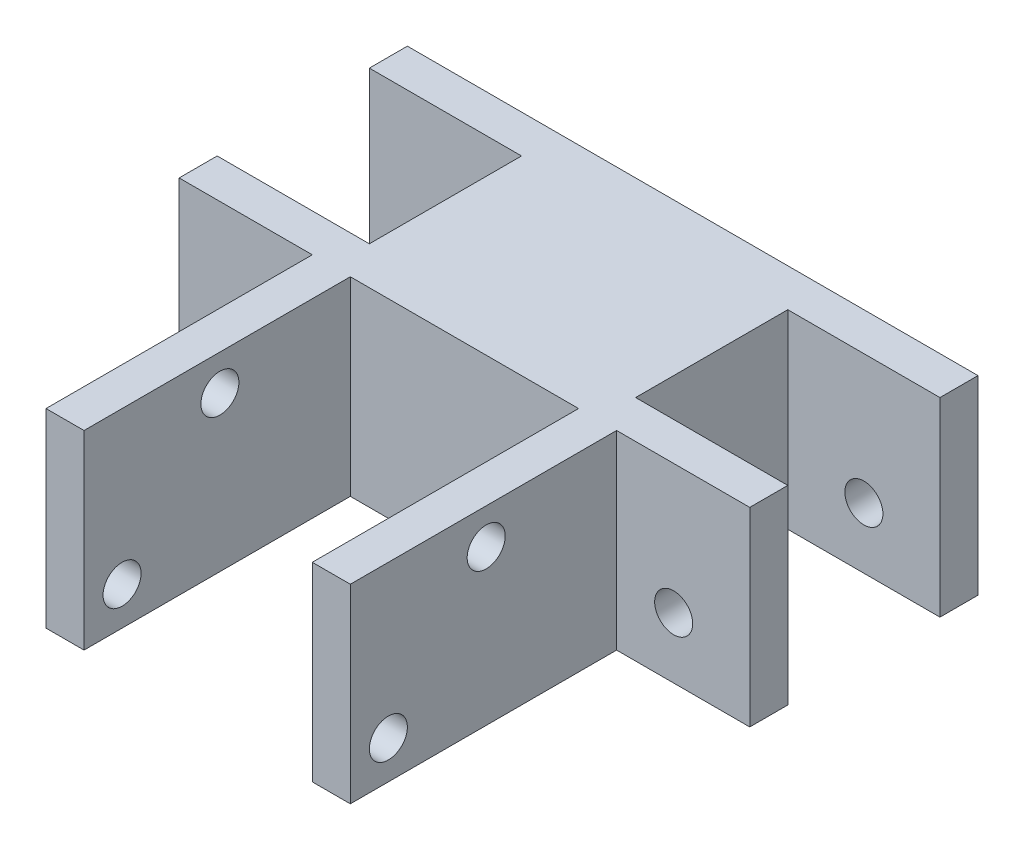
ISO-10303-21;
HEADER;
FILE_DESCRIPTION(('STEP AP214'),'2;1');
FILE_NAME('part.step','',(''),(''),'','','');
FILE_SCHEMA(('AUTOMOTIVE_DESIGN { 1 0 10303 214 1 1 1 1 }'));
ENDSEC;
DATA;
#1=APPLICATION_CONTEXT('core data for automotive mechanical design processes');
#2=APPLICATION_PROTOCOL_DEFINITION('international standard','automotive_design',2000,#1);
#3=PRODUCT_CONTEXT('',#1,'mechanical');
#4=PRODUCT('Part','Part','',(#3));
#5=PRODUCT_RELATED_PRODUCT_CATEGORY('part','',(#4));
#6=PRODUCT_DEFINITION_FORMATION('','',#4);
#7=PRODUCT_DEFINITION_CONTEXT('part definition',#1,'design');
#8=PRODUCT_DEFINITION('design','',#6,#7);
#9=PRODUCT_DEFINITION_SHAPE('','',#8);
#10=(LENGTH_UNIT() NAMED_UNIT(*) SI_UNIT(.MILLI.,.METRE.));
#11=(NAMED_UNIT(*) PLANE_ANGLE_UNIT() SI_UNIT($,.RADIAN.));
#12=(NAMED_UNIT(*) SI_UNIT($,.STERADIAN.) SOLID_ANGLE_UNIT());
#13=UNCERTAINTY_MEASURE_WITH_UNIT(LENGTH_MEASURE(1.E-05),#10,'distance_accuracy_value','');
#14=(GEOMETRIC_REPRESENTATION_CONTEXT(3) GLOBAL_UNCERTAINTY_ASSIGNED_CONTEXT((#13)) GLOBAL_UNIT_ASSIGNED_CONTEXT((#10,
#11,#12)) REPRESENTATION_CONTEXT('',''));
#15=CARTESIAN_POINT('',(0.,0.,0.));
#16=DIRECTION('',(0.,0.,1.));
#17=DIRECTION('',(1.,0.,0.));
#18=AXIS2_PLACEMENT_3D('',#15,#16,#17);
#19=CARTESIAN_POINT('',(-25.4,31.75,63.5));
#20=DIRECTION('',(0.,0.,-1.));
#21=DIRECTION('',(-1.,0.,0.));
#22=AXIS2_PLACEMENT_3D('',#19,#20,#21);
#23=PLANE('',#22);
#24=DIRECTION('',(1.,0.,0.));
#25=VECTOR('',#24,1.);
#26=CARTESIAN_POINT('',(-25.4,0.,63.5));
#27=LINE('',#26,#25);
#28=CARTESIAN_POINT('',(-25.4,0.,63.5));
#29=VERTEX_POINT('',#28);
#30=CARTESIAN_POINT('',(-19.05,0.,63.5));
#31=VERTEX_POINT('',#30);
#32=EDGE_CURVE('E207',#29,#31,#27,.T.);
#33=ORIENTED_EDGE('',*,*,#32,.T.);
#34=DIRECTION('',(0.,-1.,0.));
#35=VECTOR('',#34,1.);
#36=CARTESIAN_POINT('',(-19.05,31.75,63.5));
#37=LINE('',#36,#35);
#38=CARTESIAN_POINT('',(-19.05,31.75,63.5));
#39=VERTEX_POINT('',#38);
#40=EDGE_CURVE('E11',#39,#31,#37,.T.);
#41=ORIENTED_EDGE('',*,*,#40,.F.);
#42=DIRECTION('',(1.,0.,0.));
#43=VECTOR('',#42,1.);
#44=CARTESIAN_POINT('',(-25.4,31.75,63.5));
#45=LINE('',#44,#43);
#46=CARTESIAN_POINT('',(-25.4,31.75,63.5));
#47=VERTEX_POINT('',#46);
#48=EDGE_CURVE('E247',#47,#39,#45,.T.);
#49=ORIENTED_EDGE('',*,*,#48,.F.);
#50=DIRECTION('',(0.,-1.,0.));
#51=VECTOR('',#50,1.);
#52=CARTESIAN_POINT('',(-25.4,31.75,63.5));
#53=LINE('',#52,#51);
#54=EDGE_CURVE('E203',#47,#29,#53,.T.);
#55=ORIENTED_EDGE('',*,*,#54,.T.);
#56=EDGE_LOOP('',(#33,#41,#49,#55));
#57=FACE_BOUND('',#56,.T.);
#58=ADVANCED_FACE('F39',(#57),#23,.F.);
#59=CARTESIAN_POINT('',(-19.05,31.75,63.5));
#60=DIRECTION('',(-1.,0.,0.));
#61=DIRECTION('',(0.,0.,1.));
#62=AXIS2_PLACEMENT_3D('',#59,#60,#61);
#63=PLANE('',#62);
#64=CARTESIAN_POINT('',(-19.05,6.35,57.15));
#65=DIRECTION('',(-1.,0.,0.));
#66=DIRECTION('',(0.,0.,1.));
#67=AXIS2_PLACEMENT_3D('',#64,#65,#66);
#68=CIRCLE('',#67,3.175);
#69=CARTESIAN_POINT('',(-19.05,6.35,60.325));
#70=VERTEX_POINT('',#69);
#71=EDGE_CURVE('E562',#70,#70,#68,.T.);
#72=ORIENTED_EDGE('',*,*,#71,.T.);
#73=EDGE_LOOP('',(#72));
#74=FACE_BOUND('',#73,.T.);
#75=CARTESIAN_POINT('',(-19.05,25.8075288552219,40.8231947139618));
#76=DIRECTION('',(-1.,0.,0.));
#77=DIRECTION('',(0.,0.,1.));
#78=AXIS2_PLACEMENT_3D('',#75,#76,#77);
#79=CIRCLE('',#78,3.175);
#80=CARTESIAN_POINT('',(-19.05,25.8075288552219,43.9981947139618));
#81=VERTEX_POINT('',#80);
#82=EDGE_CURVE('E567',#81,#81,#79,.T.);
#83=ORIENTED_EDGE('',*,*,#82,.T.);
#84=EDGE_LOOP('',(#83));
#85=FACE_BOUND('',#84,.T.);
#86=DIRECTION('',(0.,0.,-1.));
#87=VECTOR('',#86,1.);
#88=CARTESIAN_POINT('',(-19.05,0.,63.5));
#89=LINE('',#88,#87);
#90=CARTESIAN_POINT('',(-19.05,0.,19.05));
#91=VERTEX_POINT('',#90);
#92=EDGE_CURVE('E210',#31,#91,#89,.T.);
#93=ORIENTED_EDGE('',*,*,#92,.T.);
#94=DIRECTION('',(0.,-1.,0.));
#95=VECTOR('',#94,1.);
#96=CARTESIAN_POINT('',(-19.05,31.75,19.05));
#97=LINE('',#96,#95);
#98=CARTESIAN_POINT('',(-19.05,31.75,19.05));
#99=VERTEX_POINT('',#98);
#100=EDGE_CURVE('E47',#99,#91,#97,.T.);
#101=ORIENTED_EDGE('',*,*,#100,.F.);
#102=DIRECTION('',(0.,0.,-1.));
#103=VECTOR('',#102,1.);
#104=CARTESIAN_POINT('',(-19.05,31.75,63.5));
#105=LINE('',#104,#103);
#106=EDGE_CURVE('E134',#39,#99,#105,.T.);
#107=ORIENTED_EDGE('',*,*,#106,.F.);
#108=ORIENTED_EDGE('',*,*,#40,.T.);
#109=EDGE_LOOP('',(#93,#101,#107,#108));
#110=FACE_BOUND('',#109,.T.);
#111=ADVANCED_FACE('F371',(#74,#85,#110),#63,.F.);
#112=CARTESIAN_POINT('',(-19.05,31.75,19.05));
#113=DIRECTION('',(0.,0.,-1.));
#114=DIRECTION('',(-1.,0.,0.));
#115=AXIS2_PLACEMENT_3D('',#112,#113,#114);
#116=PLANE('',#115);
#117=DIRECTION('',(1.,0.,0.));
#118=VECTOR('',#117,1.);
#119=CARTESIAN_POINT('',(-19.05,0.,19.05));
#120=LINE('',#119,#118);
#121=CARTESIAN_POINT('',(19.05,0.,19.05));
#122=VERTEX_POINT('',#121);
#123=EDGE_CURVE('E213',#91,#122,#120,.T.);
#124=ORIENTED_EDGE('',*,*,#123,.T.);
#125=DIRECTION('',(0.,-1.,0.));
#126=VECTOR('',#125,1.);
#127=CARTESIAN_POINT('',(19.05,31.75,19.05));
#128=LINE('',#127,#126);
#129=CARTESIAN_POINT('',(19.05,31.75,19.05));
#130=VERTEX_POINT('',#129);
#131=EDGE_CURVE('E290',#130,#122,#128,.T.);
#132=ORIENTED_EDGE('',*,*,#131,.F.);
#133=DIRECTION('',(1.,0.,0.));
#134=VECTOR('',#133,1.);
#135=CARTESIAN_POINT('',(-19.05,31.75,19.05));
#136=LINE('',#135,#134);
#137=EDGE_CURVE('E298',#99,#130,#136,.T.);
#138=ORIENTED_EDGE('',*,*,#137,.F.);
#139=ORIENTED_EDGE('',*,*,#100,.T.);
#140=EDGE_LOOP('',(#124,#132,#138,#139));
#141=FACE_BOUND('',#140,.T.);
#142=ADVANCED_FACE('F296',(#141),#116,.F.);
#143=CARTESIAN_POINT('',(19.05,31.75,19.05));
#144=DIRECTION('',(1.,0.,0.));
#145=DIRECTION('',(0.,0.,-1.));
#146=AXIS2_PLACEMENT_3D('',#143,#144,#145);
#147=PLANE('',#146);
#148=CARTESIAN_POINT('',(19.05,6.35,57.15));
#149=DIRECTION('',(-1.,0.,0.));
#150=DIRECTION('',(0.,0.,1.));
#151=AXIS2_PLACEMENT_3D('',#148,#149,#150);
#152=CIRCLE('',#151,3.175);
#153=CARTESIAN_POINT('',(19.05,6.35,60.325));
#154=VERTEX_POINT('',#153);
#155=EDGE_CURVE('E548',#154,#154,#152,.T.);
#156=ORIENTED_EDGE('',*,*,#155,.F.);
#157=EDGE_LOOP('',(#156));
#158=FACE_BOUND('',#157,.T.);
#159=CARTESIAN_POINT('',(19.05,25.8075288552219,40.8231947139618));
#160=DIRECTION('',(-1.,0.,0.));
#161=DIRECTION('',(0.,0.,1.));
#162=AXIS2_PLACEMENT_3D('',#159,#160,#161);
#163=CIRCLE('',#162,3.175);
#164=CARTESIAN_POINT('',(19.05,25.8075288552219,43.9981947139618));
#165=VERTEX_POINT('',#164);
#166=EDGE_CURVE('E556',#165,#165,#163,.T.);
#167=ORIENTED_EDGE('',*,*,#166,.F.);
#168=EDGE_LOOP('',(#167));
#169=FACE_BOUND('',#168,.T.);
#170=DIRECTION('',(0.,0.,1.));
#171=VECTOR('',#170,1.);
#172=CARTESIAN_POINT('',(19.05,0.,19.05));
#173=LINE('',#172,#171);
#174=CARTESIAN_POINT('',(19.05,0.,63.5));
#175=VERTEX_POINT('',#174);
#176=EDGE_CURVE('E215',#122,#175,#173,.T.);
#177=ORIENTED_EDGE('',*,*,#176,.T.);
#178=DIRECTION('',(0.,-1.,0.));
#179=VECTOR('',#178,1.);
#180=CARTESIAN_POINT('',(19.05,31.75,63.5));
#181=LINE('',#180,#179);
#182=CARTESIAN_POINT('',(19.05,31.75,63.5));
#183=VERTEX_POINT('',#182);
#184=EDGE_CURVE('E287',#183,#175,#181,.T.);
#185=ORIENTED_EDGE('',*,*,#184,.F.);
#186=DIRECTION('',(0.,0.,1.));
#187=VECTOR('',#186,1.);
#188=CARTESIAN_POINT('',(19.05,31.75,19.05));
#189=LINE('',#188,#187);
#190=EDGE_CURVE('E316',#130,#183,#189,.T.);
#191=ORIENTED_EDGE('',*,*,#190,.F.);
#192=ORIENTED_EDGE('',*,*,#131,.T.);
#193=EDGE_LOOP('',(#177,#185,#191,#192));
#194=FACE_BOUND('',#193,.T.);
#195=ADVANCED_FACE('F307',(#158,#169,#194),#147,.F.);
#196=CARTESIAN_POINT('',(25.4,31.75,63.5));
#197=DIRECTION('',(0.,0.,-1.));
#198=DIRECTION('',(-1.,0.,0.));
#199=AXIS2_PLACEMENT_3D('',#196,#197,#198);
#200=PLANE('',#199);
#201=DIRECTION('',(1.,0.,0.));
#202=VECTOR('',#201,1.);
#203=CARTESIAN_POINT('',(25.4,0.,63.5));
#204=LINE('',#203,#202);
#205=CARTESIAN_POINT('',(25.4,0.,63.5));
#206=VERTEX_POINT('',#205);
#207=EDGE_CURVE('E217',#175,#206,#204,.T.);
#208=ORIENTED_EDGE('',*,*,#207,.T.);
#209=DIRECTION('',(0.,-1.,0.));
#210=VECTOR('',#209,1.);
#211=CARTESIAN_POINT('',(25.4,31.75,63.5));
#212=LINE('',#211,#210);
#213=CARTESIAN_POINT('',(25.4,31.75,63.5));
#214=VERTEX_POINT('',#213);
#215=EDGE_CURVE('E284',#214,#206,#212,.T.);
#216=ORIENTED_EDGE('',*,*,#215,.F.);
#217=DIRECTION('',(1.,0.,0.));
#218=VECTOR('',#217,1.);
#219=CARTESIAN_POINT('',(25.4,31.75,63.5));
#220=LINE('',#219,#218);
#221=EDGE_CURVE('E313',#183,#214,#220,.T.);
#222=ORIENTED_EDGE('',*,*,#221,.F.);
#223=ORIENTED_EDGE('',*,*,#184,.T.);
#224=EDGE_LOOP('',(#208,#216,#222,#223));
#225=FACE_BOUND('',#224,.T.);
#226=ADVANCED_FACE('F311',(#225),#200,.F.);
#227=CARTESIAN_POINT('',(25.4,31.75,19.05));
#228=DIRECTION('',(-1.,0.,0.));
#229=DIRECTION('',(0.,0.,1.));
#230=AXIS2_PLACEMENT_3D('',#227,#228,#229);
#231=PLANE('',#230);
#232=CARTESIAN_POINT('',(25.4,6.35,57.15));
#233=DIRECTION('',(-1.,0.,0.));
#234=DIRECTION('',(0.,0.,1.));
#235=AXIS2_PLACEMENT_3D('',#232,#233,#234);
#236=CIRCLE('',#235,3.175);
#237=CARTESIAN_POINT('',(25.4,6.35,60.325));
#238=VERTEX_POINT('',#237);
#239=EDGE_CURVE('E551',#238,#238,#236,.T.);
#240=ORIENTED_EDGE('',*,*,#239,.T.);
#241=EDGE_LOOP('',(#240));
#242=FACE_BOUND('',#241,.T.);
#243=CARTESIAN_POINT('',(25.4,25.8075288552219,40.8231947139618));
#244=DIRECTION('',(-1.,0.,0.));
#245=DIRECTION('',(0.,0.,1.));
#246=AXIS2_PLACEMENT_3D('',#243,#244,#245);
#247=CIRCLE('',#246,3.175);
#248=CARTESIAN_POINT('',(25.4,25.8075288552219,43.9981947139618));
#249=VERTEX_POINT('',#248);
#250=EDGE_CURVE('E553',#249,#249,#247,.T.);
#251=ORIENTED_EDGE('',*,*,#250,.T.);
#252=EDGE_LOOP('',(#251));
#253=FACE_BOUND('',#252,.T.);
#254=DIRECTION('',(0.,0.,-1.));
#255=VECTOR('',#254,1.);
#256=CARTESIAN_POINT('',(25.4,0.,19.05));
#257=LINE('',#256,#255);
#258=CARTESIAN_POINT('',(25.4,0.,19.05));
#259=VERTEX_POINT('',#258);
#260=EDGE_CURVE('E219',#206,#259,#257,.T.);
#261=ORIENTED_EDGE('',*,*,#260,.T.);
#262=DIRECTION('',(0.,-1.,0.));
#263=VECTOR('',#262,1.);
#264=CARTESIAN_POINT('',(25.4,31.75,19.05));
#265=LINE('',#264,#263);
#266=CARTESIAN_POINT('',(25.4,31.75,19.05));
#267=VERTEX_POINT('',#266);
#268=EDGE_CURVE('E281',#267,#259,#265,.T.);
#269=ORIENTED_EDGE('',*,*,#268,.F.);
#270=DIRECTION('',(0.,0.,-1.));
#271=VECTOR('',#270,1.);
#272=CARTESIAN_POINT('',(25.4,31.75,19.05));
#273=LINE('',#272,#271);
#274=EDGE_CURVE('E315',#214,#267,#273,.T.);
#275=ORIENTED_EDGE('',*,*,#274,.F.);
#276=ORIENTED_EDGE('',*,*,#215,.T.);
#277=EDGE_LOOP('',(#261,#269,#275,#276));
#278=FACE_BOUND('',#277,.T.);
#279=ADVANCED_FACE('F388',(#242,#253,#278),#231,.F.);
#280=CARTESIAN_POINT('',(25.4,31.75,19.05));
#281=DIRECTION('',(0.,0.,-1.));
#282=DIRECTION('',(-1.,0.,0.));
#283=AXIS2_PLACEMENT_3D('',#280,#281,#282);
#284=PLANE('',#283);
#285=CARTESIAN_POINT('',(34.925,10.16,19.05));
#286=DIRECTION('',(0.,0.,1.));
#287=DIRECTION('',(1.,0.,0.));
#288=AXIS2_PLACEMENT_3D('',#285,#286,#287);
#289=CIRCLE('',#288,3.175);
#290=CARTESIAN_POINT('',(38.1,10.16,19.05));
#291=VERTEX_POINT('',#290);
#292=EDGE_CURVE('E588',#291,#291,#289,.T.);
#293=ORIENTED_EDGE('',*,*,#292,.F.);
#294=EDGE_LOOP('',(#293));
#295=FACE_BOUND('',#294,.T.);
#296=DIRECTION('',(1.,0.,0.));
#297=VECTOR('',#296,1.);
#298=CARTESIAN_POINT('',(25.4,0.,19.05));
#299=LINE('',#298,#297);
#300=CARTESIAN_POINT('',(47.625,0.,19.05));
#301=VERTEX_POINT('',#300);
#302=EDGE_CURVE('E221',#259,#301,#299,.T.);
#303=ORIENTED_EDGE('',*,*,#302,.T.);
#304=DIRECTION('',(0.,-1.,0.));
#305=VECTOR('',#304,1.);
#306=CARTESIAN_POINT('',(47.625,31.75,19.05));
#307=LINE('',#306,#305);
#308=CARTESIAN_POINT('',(47.625,31.75,19.05));
#309=VERTEX_POINT('',#308);
#310=EDGE_CURVE('E278',#309,#301,#307,.T.);
#311=ORIENTED_EDGE('',*,*,#310,.F.);
#312=DIRECTION('',(1.,0.,0.));
#313=VECTOR('',#312,1.);
#314=CARTESIAN_POINT('',(25.4,31.75,19.05));
#315=LINE('',#314,#313);
#316=EDGE_CURVE('E318',#267,#309,#315,.T.);
#317=ORIENTED_EDGE('',*,*,#316,.F.);
#318=ORIENTED_EDGE('',*,*,#268,.T.);
#319=EDGE_LOOP('',(#303,#311,#317,#318));
#320=FACE_BOUND('',#319,.T.);
#321=ADVANCED_FACE('F391',(#295,#320),#284,.F.);
#322=CARTESIAN_POINT('',(47.625,31.75,19.05));
#323=DIRECTION('',(-1.,0.,0.));
#324=DIRECTION('',(0.,0.,1.));
#325=AXIS2_PLACEMENT_3D('',#322,#323,#324);
#326=PLANE('',#325);
#327=DIRECTION('',(0.,0.,-1.));
#328=VECTOR('',#327,1.);
#329=CARTESIAN_POINT('',(47.625,0.,19.05));
#330=LINE('',#329,#328);
#331=CARTESIAN_POINT('',(47.625,0.,12.7));
#332=VERTEX_POINT('',#331);
#333=EDGE_CURVE('E223',#301,#332,#330,.T.);
#334=ORIENTED_EDGE('',*,*,#333,.T.);
#335=DIRECTION('',(0.,-1.,0.));
#336=VECTOR('',#335,1.);
#337=CARTESIAN_POINT('',(47.625,31.75,12.7));
#338=LINE('',#337,#336);
#339=CARTESIAN_POINT('',(47.625,31.75,12.7));
#340=VERTEX_POINT('',#339);
#341=EDGE_CURVE('E275',#340,#332,#338,.T.);
#342=ORIENTED_EDGE('',*,*,#341,.F.);
#343=DIRECTION('',(0.,0.,-1.));
#344=VECTOR('',#343,1.);
#345=CARTESIAN_POINT('',(47.625,31.75,19.05));
#346=LINE('',#345,#344);
#347=EDGE_CURVE('E324',#309,#340,#346,.T.);
#348=ORIENTED_EDGE('',*,*,#347,.F.);
#349=ORIENTED_EDGE('',*,*,#310,.T.);
#350=EDGE_LOOP('',(#334,#342,#348,#349));
#351=FACE_BOUND('',#350,.T.);
#352=ADVANCED_FACE('F395',(#351),#326,.F.);
#353=CARTESIAN_POINT('',(22.225,31.75,12.7));
#354=DIRECTION('',(0.,0.,1.));
#355=DIRECTION('',(1.,0.,0.));
#356=AXIS2_PLACEMENT_3D('',#353,#354,#355);
#357=PLANE('',#356);
#358=CARTESIAN_POINT('',(34.925,10.16,12.7));
#359=DIRECTION('',(0.,0.,1.));
#360=DIRECTION('',(1.,0.,0.));
#361=AXIS2_PLACEMENT_3D('',#358,#359,#360);
#362=CIRCLE('',#361,3.175);
#363=CARTESIAN_POINT('',(38.1,10.16,12.7));
#364=VERTEX_POINT('',#363);
#365=EDGE_CURVE('E211',#364,#364,#362,.T.);
#366=ORIENTED_EDGE('',*,*,#365,.T.);
#367=EDGE_LOOP('',(#366));
#368=FACE_BOUND('',#367,.T.);
#369=DIRECTION('',(-1.,0.,0.));
#370=VECTOR('',#369,1.);
#371=CARTESIAN_POINT('',(22.225,0.,12.7));
#372=LINE('',#371,#370);
#373=CARTESIAN_POINT('',(22.225,0.,12.7));
#374=VERTEX_POINT('',#373);
#375=EDGE_CURVE('E225',#332,#374,#372,.T.);
#376=ORIENTED_EDGE('',*,*,#375,.T.);
#377=DIRECTION('',(0.,-1.,0.));
#378=VECTOR('',#377,1.);
#379=CARTESIAN_POINT('',(22.225,31.75,12.7));
#380=LINE('',#379,#378);
#381=CARTESIAN_POINT('',(22.225,31.75,12.7));
#382=VERTEX_POINT('',#381);
#383=EDGE_CURVE('E272',#382,#374,#380,.T.);
#384=ORIENTED_EDGE('',*,*,#383,.F.);
#385=DIRECTION('',(-1.,0.,0.));
#386=VECTOR('',#385,1.);
#387=CARTESIAN_POINT('',(22.225,31.75,12.7));
#388=LINE('',#387,#386);
#389=EDGE_CURVE('E326',#340,#382,#388,.T.);
#390=ORIENTED_EDGE('',*,*,#389,.F.);
#391=ORIENTED_EDGE('',*,*,#341,.T.);
#392=EDGE_LOOP('',(#376,#384,#390,#391));
#393=FACE_BOUND('',#392,.T.);
#394=ADVANCED_FACE('F399',(#368,#393),#357,.F.);
#395=CARTESIAN_POINT('',(22.225,31.75,-12.7));
#396=DIRECTION('',(-1.,0.,0.));
#397=DIRECTION('',(0.,0.,1.));
#398=AXIS2_PLACEMENT_3D('',#395,#396,#397);
#399=PLANE('',#398);
#400=DIRECTION('',(0.,0.,-1.));
#401=VECTOR('',#400,1.);
#402=CARTESIAN_POINT('',(22.225,0.,-12.7));
#403=LINE('',#402,#401);
#404=CARTESIAN_POINT('',(22.225,0.,-12.7));
#405=VERTEX_POINT('',#404);
#406=EDGE_CURVE('E227',#374,#405,#403,.T.);
#407=ORIENTED_EDGE('',*,*,#406,.T.);
#408=DIRECTION('',(0.,-1.,0.));
#409=VECTOR('',#408,1.);
#410=CARTESIAN_POINT('',(22.225,31.75,-12.7));
#411=LINE('',#410,#409);
#412=CARTESIAN_POINT('',(22.225,31.75,-12.7));
#413=VERTEX_POINT('',#412);
#414=EDGE_CURVE('E269',#413,#405,#411,.T.);
#415=ORIENTED_EDGE('',*,*,#414,.F.);
#416=DIRECTION('',(0.,0.,-1.));
#417=VECTOR('',#416,1.);
#418=CARTESIAN_POINT('',(22.225,31.75,-12.7));
#419=LINE('',#418,#417);
#420=EDGE_CURVE('E328',#382,#413,#419,.T.);
#421=ORIENTED_EDGE('',*,*,#420,.F.);
#422=ORIENTED_EDGE('',*,*,#383,.T.);
#423=EDGE_LOOP('',(#407,#415,#421,#422));
#424=FACE_BOUND('',#423,.T.);
#425=ADVANCED_FACE('F403',(#424),#399,.F.);
#426=CARTESIAN_POINT('',(22.225,31.75,-12.7));
#427=DIRECTION('',(0.,0.,-1.));
#428=DIRECTION('',(-1.,0.,0.));
#429=AXIS2_PLACEMENT_3D('',#426,#427,#428);
#430=PLANE('',#429);
#431=CARTESIAN_POINT('',(34.925,10.16,-12.7));
#432=DIRECTION('',(0.,0.,1.));
#433=DIRECTION('',(1.,0.,0.));
#434=AXIS2_PLACEMENT_3D('',#431,#432,#433);
#435=CIRCLE('',#434,3.175);
#436=CARTESIAN_POINT('',(38.1,10.16,-12.7));
#437=VERTEX_POINT('',#436);
#438=EDGE_CURVE('E579',#437,#437,#435,.T.);
#439=ORIENTED_EDGE('',*,*,#438,.F.);
#440=EDGE_LOOP('',(#439));
#441=FACE_BOUND('',#440,.T.);
#442=DIRECTION('',(1.,0.,0.));
#443=VECTOR('',#442,1.);
#444=CARTESIAN_POINT('',(22.225,0.,-12.7));
#445=LINE('',#444,#443);
#446=CARTESIAN_POINT('',(47.625,0.,-12.7));
#447=VERTEX_POINT('',#446);
#448=EDGE_CURVE('E229',#405,#447,#445,.T.);
#449=ORIENTED_EDGE('',*,*,#448,.T.);
#450=DIRECTION('',(0.,-1.,0.));
#451=VECTOR('',#450,1.);
#452=CARTESIAN_POINT('',(47.625,31.75,-12.7));
#453=LINE('',#452,#451);
#454=CARTESIAN_POINT('',(47.625,31.75,-12.7));
#455=VERTEX_POINT('',#454);
#456=EDGE_CURVE('E266',#455,#447,#453,.T.);
#457=ORIENTED_EDGE('',*,*,#456,.F.);
#458=DIRECTION('',(1.,0.,0.));
#459=VECTOR('',#458,1.);
#460=CARTESIAN_POINT('',(22.225,31.75,-12.7));
#461=LINE('',#460,#459);
#462=EDGE_CURVE('E330',#413,#455,#461,.T.);
#463=ORIENTED_EDGE('',*,*,#462,.F.);
#464=ORIENTED_EDGE('',*,*,#414,.T.);
#465=EDGE_LOOP('',(#449,#457,#463,#464));
#466=FACE_BOUND('',#465,.T.);
#467=ADVANCED_FACE('F407',(#441,#466),#430,.F.);
#468=CARTESIAN_POINT('',(47.625,31.75,-19.05));
#469=DIRECTION('',(-1.,0.,0.));
#470=DIRECTION('',(0.,0.,1.));
#471=AXIS2_PLACEMENT_3D('',#468,#469,#470);
#472=PLANE('',#471);
#473=DIRECTION('',(0.,0.,-1.));
#474=VECTOR('',#473,1.);
#475=CARTESIAN_POINT('',(47.625,0.,-19.05));
#476=LINE('',#475,#474);
#477=CARTESIAN_POINT('',(47.625,0.,-19.05));
#478=VERTEX_POINT('',#477);
#479=EDGE_CURVE('E231',#447,#478,#476,.T.);
#480=ORIENTED_EDGE('',*,*,#479,.T.);
#481=DIRECTION('',(0.,-1.,0.));
#482=VECTOR('',#481,1.);
#483=CARTESIAN_POINT('',(47.625,31.75,-19.05));
#484=LINE('',#483,#482);
#485=CARTESIAN_POINT('',(47.625,31.75,-19.05));
#486=VERTEX_POINT('',#485);
#487=EDGE_CURVE('E263',#486,#478,#484,.T.);
#488=ORIENTED_EDGE('',*,*,#487,.F.);
#489=DIRECTION('',(0.,0.,-1.));
#490=VECTOR('',#489,1.);
#491=CARTESIAN_POINT('',(47.625,31.75,-19.05));
#492=LINE('',#491,#490);
#493=EDGE_CURVE('E332',#455,#486,#492,.T.);
#494=ORIENTED_EDGE('',*,*,#493,.F.);
#495=ORIENTED_EDGE('',*,*,#456,.T.);
#496=EDGE_LOOP('',(#480,#488,#494,#495));
#497=FACE_BOUND('',#496,.T.);
#498=ADVANCED_FACE('F411',(#497),#472,.F.);
#499=CARTESIAN_POINT('',(-22.225,31.75,-19.05));
#500=DIRECTION('',(0.,0.,1.));
#501=DIRECTION('',(1.,0.,0.));
#502=AXIS2_PLACEMENT_3D('',#499,#500,#501);
#503=PLANE('',#502);
#504=CARTESIAN_POINT('',(-34.925,10.16,-19.05));
#505=DIRECTION('',(0.,0.,1.));
#506=DIRECTION('',(1.,0.,0.));
#507=AXIS2_PLACEMENT_3D('',#504,#505,#506);
#508=CIRCLE('',#507,3.17500000000001);
#509=CARTESIAN_POINT('',(-31.75,10.16,-19.05));
#510=VERTEX_POINT('',#509);
#511=EDGE_CURVE('E570',#510,#510,#508,.T.);
#512=ORIENTED_EDGE('',*,*,#511,.T.);
#513=EDGE_LOOP('',(#512));
#514=FACE_BOUND('',#513,.T.);
#515=CARTESIAN_POINT('',(34.925,10.16,-19.05));
#516=DIRECTION('',(0.,0.,1.));
#517=DIRECTION('',(1.,0.,0.));
#518=AXIS2_PLACEMENT_3D('',#515,#516,#517);
#519=CIRCLE('',#518,3.175);
#520=CARTESIAN_POINT('',(38.1,10.16,-19.05));
#521=VERTEX_POINT('',#520);
#522=EDGE_CURVE('E576',#521,#521,#519,.T.);
#523=ORIENTED_EDGE('',*,*,#522,.T.);
#524=EDGE_LOOP('',(#523));
#525=FACE_BOUND('',#524,.T.);
#526=DIRECTION('',(-1.,0.,0.));
#527=VECTOR('',#526,1.);
#528=CARTESIAN_POINT('',(-22.225,0.,-19.05));
#529=LINE('',#528,#527);
#530=CARTESIAN_POINT('',(-47.625,0.,-19.05));
#531=VERTEX_POINT('',#530);
#532=EDGE_CURVE('E234',#478,#531,#529,.T.);
#533=ORIENTED_EDGE('',*,*,#532,.T.);
#534=DIRECTION('',(0.,-1.,0.));
#535=VECTOR('',#534,1.);
#536=CARTESIAN_POINT('',(-47.625,31.75,-19.05));
#537=LINE('',#536,#535);
#538=CARTESIAN_POINT('',(-47.625,31.75,-19.05));
#539=VERTEX_POINT('',#538);
#540=EDGE_CURVE('E260',#539,#531,#537,.T.);
#541=ORIENTED_EDGE('',*,*,#540,.F.);
#542=DIRECTION('',(-1.,0.,0.));
#543=VECTOR('',#542,1.);
#544=CARTESIAN_POINT('',(22.225,31.75,-19.05));
#545=LINE('',#544,#543);
#546=EDGE_CURVE('E334',#486,#539,#545,.T.);
#547=ORIENTED_EDGE('',*,*,#546,.F.);
#548=ORIENTED_EDGE('',*,*,#487,.T.);
#549=EDGE_LOOP('',(#533,#541,#547,#548));
#550=FACE_BOUND('',#549,.T.);
#551=ADVANCED_FACE('F415',(#514,#525,#550),#503,.F.);
#552=CARTESIAN_POINT('',(-47.625,31.75,-19.05));
#553=DIRECTION('',(1.,0.,0.));
#554=DIRECTION('',(0.,0.,-1.));
#555=AXIS2_PLACEMENT_3D('',#552,#553,#554);
#556=PLANE('',#555);
#557=DIRECTION('',(0.,0.,1.));
#558=VECTOR('',#557,1.);
#559=CARTESIAN_POINT('',(-47.625,0.,-19.05));
#560=LINE('',#559,#558);
#561=CARTESIAN_POINT('',(-47.625,0.,-12.7));
#562=VERTEX_POINT('',#561);
#563=EDGE_CURVE('E236',#531,#562,#560,.T.);
#564=ORIENTED_EDGE('',*,*,#563,.T.);
#565=DIRECTION('',(0.,-1.,0.));
#566=VECTOR('',#565,1.);
#567=CARTESIAN_POINT('',(-47.625,31.75,-12.7));
#568=LINE('',#567,#566);
#569=CARTESIAN_POINT('',(-47.625,31.75,-12.7));
#570=VERTEX_POINT('',#569);
#571=EDGE_CURVE('E257',#570,#562,#568,.T.);
#572=ORIENTED_EDGE('',*,*,#571,.F.);
#573=DIRECTION('',(0.,0.,1.));
#574=VECTOR('',#573,1.);
#575=CARTESIAN_POINT('',(-47.625,31.75,-19.05));
#576=LINE('',#575,#574);
#577=EDGE_CURVE('E336',#539,#570,#576,.T.);
#578=ORIENTED_EDGE('',*,*,#577,.F.);
#579=ORIENTED_EDGE('',*,*,#540,.T.);
#580=EDGE_LOOP('',(#564,#572,#578,#579));
#581=FACE_BOUND('',#580,.T.);
#582=ADVANCED_FACE('F419',(#581),#556,.F.);
#583=CARTESIAN_POINT('',(-22.225,31.75,-12.7));
#584=DIRECTION('',(0.,0.,-1.));
#585=DIRECTION('',(-1.,0.,0.));
#586=AXIS2_PLACEMENT_3D('',#583,#584,#585);
#587=PLANE('',#586);
#588=CARTESIAN_POINT('',(-34.925,10.16,-12.7));
#589=DIRECTION('',(0.,0.,1.));
#590=DIRECTION('',(1.,0.,0.));
#591=AXIS2_PLACEMENT_3D('',#588,#589,#590);
#592=CIRCLE('',#591,3.17500000000001);
#593=CARTESIAN_POINT('',(-31.75,10.16,-12.7));
#594=VERTEX_POINT('',#593);
#595=EDGE_CURVE('E573',#594,#594,#592,.T.);
#596=ORIENTED_EDGE('',*,*,#595,.F.);
#597=EDGE_LOOP('',(#596));
#598=FACE_BOUND('',#597,.T.);
#599=DIRECTION('',(1.,0.,0.));
#600=VECTOR('',#599,1.);
#601=CARTESIAN_POINT('',(-22.225,0.,-12.7));
#602=LINE('',#601,#600);
#603=CARTESIAN_POINT('',(-22.225,0.,-12.7));
#604=VERTEX_POINT('',#603);
#605=EDGE_CURVE('E238',#562,#604,#602,.T.);
#606=ORIENTED_EDGE('',*,*,#605,.T.);
#607=DIRECTION('',(0.,-1.,0.));
#608=VECTOR('',#607,1.);
#609=CARTESIAN_POINT('',(-22.225,31.75,-12.7));
#610=LINE('',#609,#608);
#611=CARTESIAN_POINT('',(-22.225,31.75,-12.7));
#612=VERTEX_POINT('',#611);
#613=EDGE_CURVE('E254',#612,#604,#610,.T.);
#614=ORIENTED_EDGE('',*,*,#613,.F.);
#615=DIRECTION('',(1.,0.,0.));
#616=VECTOR('',#615,1.);
#617=CARTESIAN_POINT('',(-22.225,31.75,-12.7));
#618=LINE('',#617,#616);
#619=EDGE_CURVE('E338',#570,#612,#618,.T.);
#620=ORIENTED_EDGE('',*,*,#619,.F.);
#621=ORIENTED_EDGE('',*,*,#571,.T.);
#622=EDGE_LOOP('',(#606,#614,#620,#621));
#623=FACE_BOUND('',#622,.T.);
#624=ADVANCED_FACE('F423',(#598,#623),#587,.F.);
#625=CARTESIAN_POINT('',(-22.225,31.75,-12.7));
#626=DIRECTION('',(1.,0.,0.));
#627=DIRECTION('',(0.,0.,-1.));
#628=AXIS2_PLACEMENT_3D('',#625,#626,#627);
#629=PLANE('',#628);
#630=DIRECTION('',(0.,0.,1.));
#631=VECTOR('',#630,1.);
#632=CARTESIAN_POINT('',(-22.225,0.,-12.7));
#633=LINE('',#632,#631);
#634=CARTESIAN_POINT('',(-22.225,0.,12.7));
#635=VERTEX_POINT('',#634);
#636=EDGE_CURVE('E240',#604,#635,#633,.T.);
#637=ORIENTED_EDGE('',*,*,#636,.T.);
#638=DIRECTION('',(0.,-1.,0.));
#639=VECTOR('',#638,1.);
#640=CARTESIAN_POINT('',(-22.225,31.75,12.7));
#641=LINE('',#640,#639);
#642=CARTESIAN_POINT('',(-22.225,31.75,12.7));
#643=VERTEX_POINT('',#642);
#644=EDGE_CURVE('E251',#643,#635,#641,.T.);
#645=ORIENTED_EDGE('',*,*,#644,.F.);
#646=DIRECTION('',(0.,0.,1.));
#647=VECTOR('',#646,1.);
#648=CARTESIAN_POINT('',(-22.225,31.75,-12.7));
#649=LINE('',#648,#647);
#650=EDGE_CURVE('E340',#612,#643,#649,.T.);
#651=ORIENTED_EDGE('',*,*,#650,.F.);
#652=ORIENTED_EDGE('',*,*,#613,.T.);
#653=EDGE_LOOP('',(#637,#645,#651,#652));
#654=FACE_BOUND('',#653,.T.);
#655=ADVANCED_FACE('F346',(#654),#629,.F.);
#656=CARTESIAN_POINT('',(-22.225,31.75,12.7));
#657=DIRECTION('',(0.,0.,1.));
#658=DIRECTION('',(1.,0.,0.));
#659=AXIS2_PLACEMENT_3D('',#656,#657,#658);
#660=PLANE('',#659);
#661=CARTESIAN_POINT('',(-34.925,10.16,12.7));
#662=DIRECTION('',(0.,0.,1.));
#663=DIRECTION('',(1.,0.,0.));
#664=AXIS2_PLACEMENT_3D('',#661,#662,#663);
#665=CIRCLE('',#664,3.17500000000001);
#666=CARTESIAN_POINT('',(-31.75,10.16,12.7));
#667=VERTEX_POINT('',#666);
#668=EDGE_CURVE('E585',#667,#667,#665,.T.);
#669=ORIENTED_EDGE('',*,*,#668,.T.);
#670=EDGE_LOOP('',(#669));
#671=FACE_BOUND('',#670,.T.);
#672=DIRECTION('',(-1.,0.,0.));
#673=VECTOR('',#672,1.);
#674=CARTESIAN_POINT('',(-22.225,0.,12.7));
#675=LINE('',#674,#673);
#676=CARTESIAN_POINT('',(-47.625,0.,12.7));
#677=VERTEX_POINT('',#676);
#678=EDGE_CURVE('E242',#635,#677,#675,.T.);
#679=ORIENTED_EDGE('',*,*,#678,.T.);
#680=DIRECTION('',(0.,-1.,0.));
#681=VECTOR('',#680,1.);
#682=CARTESIAN_POINT('',(-47.625,31.75,12.7));
#683=LINE('',#682,#681);
#684=CARTESIAN_POINT('',(-47.625,31.75,12.7));
#685=VERTEX_POINT('',#684);
#686=EDGE_CURVE('E198',#685,#677,#683,.T.);
#687=ORIENTED_EDGE('',*,*,#686,.F.);
#688=DIRECTION('',(-1.,0.,0.));
#689=VECTOR('',#688,1.);
#690=CARTESIAN_POINT('',(-22.225,31.75,12.7));
#691=LINE('',#690,#689);
#692=EDGE_CURVE('E189',#643,#685,#691,.T.);
#693=ORIENTED_EDGE('',*,*,#692,.F.);
#694=ORIENTED_EDGE('',*,*,#644,.T.);
#695=EDGE_LOOP('',(#679,#687,#693,#694));
#696=FACE_BOUND('',#695,.T.);
#697=ADVANCED_FACE('F350',(#671,#696),#660,.F.);
#698=CARTESIAN_POINT('',(-47.625,31.75,19.05));
#699=DIRECTION('',(1.,0.,0.));
#700=DIRECTION('',(0.,0.,-1.));
#701=AXIS2_PLACEMENT_3D('',#698,#699,#700);
#702=PLANE('',#701);
#703=DIRECTION('',(0.,0.,1.));
#704=VECTOR('',#703,1.);
#705=CARTESIAN_POINT('',(-47.625,0.,19.05));
#706=LINE('',#705,#704);
#707=CARTESIAN_POINT('',(-47.625,0.,19.05));
#708=VERTEX_POINT('',#707);
#709=EDGE_CURVE('E197',#677,#708,#706,.T.);
#710=ORIENTED_EDGE('',*,*,#709,.T.);
#711=DIRECTION('',(0.,-1.,0.));
#712=VECTOR('',#711,1.);
#713=CARTESIAN_POINT('',(-47.625,31.75,19.05));
#714=LINE('',#713,#712);
#715=CARTESIAN_POINT('',(-47.625,31.75,19.05));
#716=VERTEX_POINT('',#715);
#717=EDGE_CURVE('E194',#716,#708,#714,.T.);
#718=ORIENTED_EDGE('',*,*,#717,.F.);
#719=DIRECTION('',(0.,0.,1.));
#720=VECTOR('',#719,1.);
#721=CARTESIAN_POINT('',(-47.625,31.75,19.05));
#722=LINE('',#721,#720);
#723=EDGE_CURVE('E183',#685,#716,#722,.T.);
#724=ORIENTED_EDGE('',*,*,#723,.F.);
#725=ORIENTED_EDGE('',*,*,#686,.T.);
#726=EDGE_LOOP('',(#710,#718,#724,#725));
#727=FACE_BOUND('',#726,.T.);
#728=ADVANCED_FACE('F195',(#727),#702,.F.);
#729=CARTESIAN_POINT('',(-47.625,31.75,19.05));
#730=DIRECTION('',(0.,0.,-1.));
#731=DIRECTION('',(-1.,0.,0.));
#732=AXIS2_PLACEMENT_3D('',#729,#730,#731);
#733=PLANE('',#732);
#734=CARTESIAN_POINT('',(-34.925,10.16,19.05));
#735=DIRECTION('',(0.,0.,1.));
#736=DIRECTION('',(1.,0.,0.));
#737=AXIS2_PLACEMENT_3D('',#734,#735,#736);
#738=CIRCLE('',#737,3.17500000000001);
#739=CARTESIAN_POINT('',(-31.75,10.16,19.05));
#740=VERTEX_POINT('',#739);
#741=EDGE_CURVE('E582',#740,#740,#738,.T.);
#742=ORIENTED_EDGE('',*,*,#741,.F.);
#743=EDGE_LOOP('',(#742));
#744=FACE_BOUND('',#743,.T.);
#745=DIRECTION('',(1.,0.,0.));
#746=VECTOR('',#745,1.);
#747=CARTESIAN_POINT('',(-47.625,0.,19.05));
#748=LINE('',#747,#746);
#749=CARTESIAN_POINT('',(-25.4,0.,19.05));
#750=VERTEX_POINT('',#749);
#751=EDGE_CURVE('E120',#708,#750,#748,.T.);
#752=ORIENTED_EDGE('',*,*,#751,.T.);
#753=DIRECTION('',(0.,-1.,0.));
#754=VECTOR('',#753,1.);
#755=CARTESIAN_POINT('',(-25.4,31.75,19.05));
#756=LINE('',#755,#754);
#757=CARTESIAN_POINT('',(-25.4,31.75,19.05));
#758=VERTEX_POINT('',#757);
#759=EDGE_CURVE('E199',#758,#750,#756,.T.);
#760=ORIENTED_EDGE('',*,*,#759,.F.);
#761=DIRECTION('',(1.,0.,0.));
#762=VECTOR('',#761,1.);
#763=CARTESIAN_POINT('',(-47.625,31.75,19.05));
#764=LINE('',#763,#762);
#765=EDGE_CURVE('E187',#716,#758,#764,.T.);
#766=ORIENTED_EDGE('',*,*,#765,.F.);
#767=ORIENTED_EDGE('',*,*,#717,.T.);
#768=EDGE_LOOP('',(#752,#760,#766,#767));
#769=FACE_BOUND('',#768,.T.);
#770=ADVANCED_FACE('F201',(#744,#769),#733,.F.);
#771=CARTESIAN_POINT('',(-25.4,31.75,19.05));
#772=DIRECTION('',(1.,0.,0.));
#773=DIRECTION('',(0.,0.,-1.));
#774=AXIS2_PLACEMENT_3D('',#771,#772,#773);
#775=PLANE('',#774);
#776=CARTESIAN_POINT('',(-25.4,6.35,57.15));
#777=DIRECTION('',(-1.,0.,0.));
#778=DIRECTION('',(0.,0.,1.));
#779=AXIS2_PLACEMENT_3D('',#776,#777,#778);
#780=CIRCLE('',#779,3.175);
#781=CARTESIAN_POINT('',(-25.4,6.35,60.325));
#782=VERTEX_POINT('',#781);
#783=EDGE_CURVE('E559',#782,#782,#780,.T.);
#784=ORIENTED_EDGE('',*,*,#783,.F.);
#785=EDGE_LOOP('',(#784));
#786=FACE_BOUND('',#785,.T.);
#787=CARTESIAN_POINT('',(-25.4,25.8075288552219,40.8231947139618));
#788=DIRECTION('',(-1.,0.,0.));
#789=DIRECTION('',(0.,0.,1.));
#790=AXIS2_PLACEMENT_3D('',#787,#788,#789);
#791=CIRCLE('',#790,3.175);
#792=CARTESIAN_POINT('',(-25.4,25.8075288552219,43.9981947139618));
#793=VERTEX_POINT('',#792);
#794=EDGE_CURVE('E564',#793,#793,#791,.T.);
#795=ORIENTED_EDGE('',*,*,#794,.F.);
#796=EDGE_LOOP('',(#795));
#797=FACE_BOUND('',#796,.T.);
#798=DIRECTION('',(0.,0.,1.));
#799=VECTOR('',#798,1.);
#800=CARTESIAN_POINT('',(-25.4,0.,19.05));
#801=LINE('',#800,#799);
#802=EDGE_CURVE('E126',#750,#29,#801,.T.);
#803=ORIENTED_EDGE('',*,*,#802,.T.);
#804=ORIENTED_EDGE('',*,*,#54,.F.);
#805=DIRECTION('',(0.,0.,1.));
#806=VECTOR('',#805,1.);
#807=CARTESIAN_POINT('',(-25.4,31.75,19.05));
#808=LINE('',#807,#806);
#809=EDGE_CURVE('E55',#758,#47,#808,.T.);
#810=ORIENTED_EDGE('',*,*,#809,.F.);
#811=ORIENTED_EDGE('',*,*,#759,.T.);
#812=EDGE_LOOP('',(#803,#804,#810,#811));
#813=FACE_BOUND('',#812,.T.);
#814=ADVANCED_FACE('F354',(#786,#797,#813),#775,.F.);
#815=CARTESIAN_POINT('',(0.,31.75,0.));
#816=DIRECTION('',(0.,1.,0.));
#817=DIRECTION('',(0.,0.,1.));
#818=AXIS2_PLACEMENT_3D('',#815,#816,#817);
#819=PLANE('',#818);
#820=ORIENTED_EDGE('',*,*,#48,.T.);
#821=ORIENTED_EDGE('',*,*,#106,.T.);
#822=ORIENTED_EDGE('',*,*,#137,.T.);
#823=ORIENTED_EDGE('',*,*,#190,.T.);
#824=ORIENTED_EDGE('',*,*,#221,.T.);
#825=ORIENTED_EDGE('',*,*,#274,.T.);
#826=ORIENTED_EDGE('',*,*,#316,.T.);
#827=ORIENTED_EDGE('',*,*,#347,.T.);
#828=ORIENTED_EDGE('',*,*,#389,.T.);
#829=ORIENTED_EDGE('',*,*,#420,.T.);
#830=ORIENTED_EDGE('',*,*,#462,.T.);
#831=ORIENTED_EDGE('',*,*,#493,.T.);
#832=ORIENTED_EDGE('',*,*,#546,.T.);
#833=ORIENTED_EDGE('',*,*,#577,.T.);
#834=ORIENTED_EDGE('',*,*,#619,.T.);
#835=ORIENTED_EDGE('',*,*,#650,.T.);
#836=ORIENTED_EDGE('',*,*,#692,.T.);
#837=ORIENTED_EDGE('',*,*,#723,.T.);
#838=ORIENTED_EDGE('',*,*,#765,.T.);
#839=ORIENTED_EDGE('',*,*,#809,.T.);
#840=EDGE_LOOP('',(#820,#821,#822,#823,#824,#825,#826,#827,#828,#829,#830,#831,#832,#833,#834,
#835,#836,#837,#838,#839));
#841=FACE_BOUND('',#840,.T.);
#842=ADVANCED_FACE('F185',(#841),#819,.T.);
#843=CARTESIAN_POINT('',(0.,0.,0.));
#844=DIRECTION('',(0.,1.,0.));
#845=DIRECTION('',(0.,0.,1.));
#846=AXIS2_PLACEMENT_3D('',#843,#844,#845);
#847=PLANE('',#846);
#848=ORIENTED_EDGE('',*,*,#32,.F.);
#849=ORIENTED_EDGE('',*,*,#802,.F.);
#850=ORIENTED_EDGE('',*,*,#751,.F.);
#851=ORIENTED_EDGE('',*,*,#709,.F.);
#852=ORIENTED_EDGE('',*,*,#678,.F.);
#853=ORIENTED_EDGE('',*,*,#636,.F.);
#854=ORIENTED_EDGE('',*,*,#605,.F.);
#855=ORIENTED_EDGE('',*,*,#563,.F.);
#856=ORIENTED_EDGE('',*,*,#532,.F.);
#857=ORIENTED_EDGE('',*,*,#479,.F.);
#858=ORIENTED_EDGE('',*,*,#448,.F.);
#859=ORIENTED_EDGE('',*,*,#406,.F.);
#860=ORIENTED_EDGE('',*,*,#375,.F.);
#861=ORIENTED_EDGE('',*,*,#333,.F.);
#862=ORIENTED_EDGE('',*,*,#302,.F.);
#863=ORIENTED_EDGE('',*,*,#260,.F.);
#864=ORIENTED_EDGE('',*,*,#207,.F.);
#865=ORIENTED_EDGE('',*,*,#176,.F.);
#866=ORIENTED_EDGE('',*,*,#123,.F.);
#867=ORIENTED_EDGE('',*,*,#92,.F.);
#868=EDGE_LOOP('',(#848,#849,#850,#851,#852,#853,#854,#855,#856,#857,#858,#859,#860,#861,#862,
#863,#864,#865,#866,#867));
#869=FACE_BOUND('',#868,.T.);
#870=ADVANCED_FACE('F302',(#869),#847,.F.);
#871=CARTESIAN_POINT('',(34.925,10.16,12.7));
#872=DIRECTION('',(0.,0.,1.));
#873=DIRECTION('',(1.,0.,0.));
#874=AXIS2_PLACEMENT_3D('',#871,#872,#873);
#875=CYLINDRICAL_SURFACE('',#874,3.175);
#876=ORIENTED_EDGE('',*,*,#365,.F.);
#877=EDGE_LOOP('',(#876));
#878=FACE_BOUND('',#877,.T.);
#879=ORIENTED_EDGE('',*,*,#292,.T.);
#880=EDGE_LOOP('',(#879));
#881=FACE_BOUND('',#880,.T.);
#882=ADVANCED_FACE('F449',(#878,#881),#875,.F.);
#883=CARTESIAN_POINT('',(-34.925,10.16,12.7));
#884=DIRECTION('',(0.,0.,1.));
#885=DIRECTION('',(1.,0.,0.));
#886=AXIS2_PLACEMENT_3D('',#883,#884,#885);
#887=CYLINDRICAL_SURFACE('',#886,3.17500000000001);
#888=ORIENTED_EDGE('',*,*,#668,.F.);
#889=EDGE_LOOP('',(#888));
#890=FACE_BOUND('',#889,.T.);
#891=ORIENTED_EDGE('',*,*,#741,.T.);
#892=EDGE_LOOP('',(#891));
#893=FACE_BOUND('',#892,.T.);
#894=ADVANCED_FACE('F473',(#890,#893),#887,.F.);
#895=CARTESIAN_POINT('',(34.925,10.16,-12.7));
#896=DIRECTION('',(0.,0.,-1.));
#897=DIRECTION('',(-1.,0.,0.));
#898=AXIS2_PLACEMENT_3D('',#895,#896,#897);
#899=CYLINDRICAL_SURFACE('',#898,3.175);
#900=ORIENTED_EDGE('',*,*,#438,.T.);
#901=EDGE_LOOP('',(#900));
#902=FACE_BOUND('',#901,.T.);
#903=ORIENTED_EDGE('',*,*,#522,.F.);
#904=EDGE_LOOP('',(#903));
#905=FACE_BOUND('',#904,.T.);
#906=ADVANCED_FACE('F480',(#902,#905),#899,.F.);
#907=CARTESIAN_POINT('',(-34.925,10.16,-12.7));
#908=DIRECTION('',(0.,0.,-1.));
#909=DIRECTION('',(-1.,0.,0.));
#910=AXIS2_PLACEMENT_3D('',#907,#908,#909);
#911=CYLINDRICAL_SURFACE('',#910,3.17500000000001);
#912=ORIENTED_EDGE('',*,*,#595,.T.);
#913=EDGE_LOOP('',(#912));
#914=FACE_BOUND('',#913,.T.);
#915=ORIENTED_EDGE('',*,*,#511,.F.);
#916=EDGE_LOOP('',(#915));
#917=FACE_BOUND('',#916,.T.);
#918=ADVANCED_FACE('F503',(#914,#917),#911,.F.);
#919=CARTESIAN_POINT('',(-19.05,25.8075288552219,40.8231947139618));
#920=DIRECTION('',(-1.,0.,0.));
#921=DIRECTION('',(0.,0.,1.));
#922=AXIS2_PLACEMENT_3D('',#919,#920,#921);
#923=CYLINDRICAL_SURFACE('',#922,3.175);
#924=ORIENTED_EDGE('',*,*,#82,.F.);
#925=EDGE_LOOP('',(#924));
#926=FACE_BOUND('',#925,.T.);
#927=ORIENTED_EDGE('',*,*,#794,.T.);
#928=EDGE_LOOP('',(#927));
#929=FACE_BOUND('',#928,.T.);
#930=ADVANCED_FACE('F510',(#926,#929),#923,.F.);
#931=CARTESIAN_POINT('',(-19.05,6.35,57.15));
#932=DIRECTION('',(-1.,0.,0.));
#933=DIRECTION('',(0.,0.,1.));
#934=AXIS2_PLACEMENT_3D('',#931,#932,#933);
#935=CYLINDRICAL_SURFACE('',#934,3.175);
#936=ORIENTED_EDGE('',*,*,#71,.F.);
#937=EDGE_LOOP('',(#936));
#938=FACE_BOUND('',#937,.T.);
#939=ORIENTED_EDGE('',*,*,#783,.T.);
#940=EDGE_LOOP('',(#939));
#941=FACE_BOUND('',#940,.T.);
#942=ADVANCED_FACE('F519',(#938,#941),#935,.F.);
#943=CARTESIAN_POINT('',(19.05,25.8075288552219,40.8231947139618));
#944=DIRECTION('',(1.,0.,0.));
#945=DIRECTION('',(0.,0.,-1.));
#946=AXIS2_PLACEMENT_3D('',#943,#944,#945);
#947=CYLINDRICAL_SURFACE('',#946,3.175);
#948=ORIENTED_EDGE('',*,*,#166,.T.);
#949=EDGE_LOOP('',(#948));
#950=FACE_BOUND('',#949,.T.);
#951=ORIENTED_EDGE('',*,*,#250,.F.);
#952=EDGE_LOOP('',(#951));
#953=FACE_BOUND('',#952,.T.);
#954=ADVANCED_FACE('F527',(#950,#953),#947,.F.);
#955=CARTESIAN_POINT('',(19.05,6.35,57.15));
#956=DIRECTION('',(1.,0.,0.));
#957=DIRECTION('',(0.,0.,-1.));
#958=AXIS2_PLACEMENT_3D('',#955,#956,#957);
#959=CYLINDRICAL_SURFACE('',#958,3.175);
#960=ORIENTED_EDGE('',*,*,#155,.T.);
#961=EDGE_LOOP('',(#960));
#962=FACE_BOUND('',#961,.T.);
#963=ORIENTED_EDGE('',*,*,#239,.F.);
#964=EDGE_LOOP('',(#963));
#965=FACE_BOUND('',#964,.T.);
#966=ADVANCED_FACE('F535',(#962,#965),#959,.F.);
#967=CLOSED_SHELL('',(#58,#111,#142,#195,#226,#279,#321,#352,#394,#425,#467,#498,#551,#582,#624,
#655,#697,#728,#770,#814,#842,#870,#882,#894,#906,#918,#930,#942,#954,#966));
#968=MANIFOLD_SOLID_BREP('B2',#967);
#969=ADVANCED_BREP_SHAPE_REPRESENTATION('',(#18,#968),#14);
#970=SHAPE_DEFINITION_REPRESENTATION(#9,#969);
ENDSEC;
END-ISO-10303-21;
